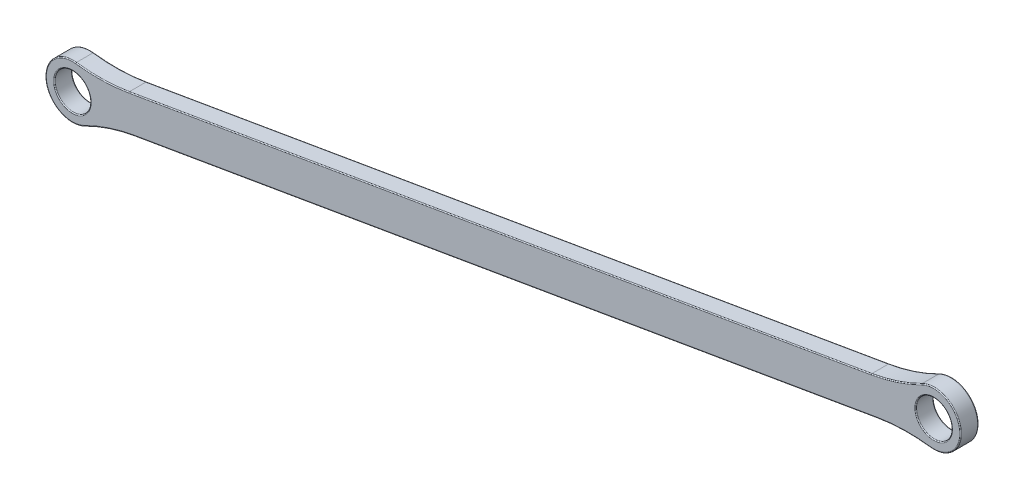
ISO-10303-21;
HEADER;
FILE_DESCRIPTION(('STEP AP214'),'2;1');
FILE_NAME('part.step','',(''),(''),'','','');
FILE_SCHEMA(('AUTOMOTIVE_DESIGN { 1 0 10303 214 1 1 1 1 }'));
ENDSEC;
DATA;
#1=APPLICATION_CONTEXT('core data for automotive mechanical design processes');
#2=APPLICATION_PROTOCOL_DEFINITION('international standard','automotive_design',2000,#1);
#3=PRODUCT_CONTEXT('',#1,'mechanical');
#4=PRODUCT('Part','Part','',(#3));
#5=PRODUCT_RELATED_PRODUCT_CATEGORY('part','',(#4));
#6=PRODUCT_DEFINITION_FORMATION('','',#4);
#7=PRODUCT_DEFINITION_CONTEXT('part definition',#1,'design');
#8=PRODUCT_DEFINITION('design','',#6,#7);
#9=PRODUCT_DEFINITION_SHAPE('','',#8);
#10=(LENGTH_UNIT() NAMED_UNIT(*) SI_UNIT(.MILLI.,.METRE.));
#11=(NAMED_UNIT(*) PLANE_ANGLE_UNIT() SI_UNIT($,.RADIAN.));
#12=(NAMED_UNIT(*) SI_UNIT($,.STERADIAN.) SOLID_ANGLE_UNIT());
#13=UNCERTAINTY_MEASURE_WITH_UNIT(LENGTH_MEASURE(1.E-05),#10,'distance_accuracy_value','');
#14=(GEOMETRIC_REPRESENTATION_CONTEXT(3) GLOBAL_UNCERTAINTY_ASSIGNED_CONTEXT((#13)) GLOBAL_UNIT_ASSIGNED_CONTEXT((#10,
#11,#12)) REPRESENTATION_CONTEXT('',''));
#15=CARTESIAN_POINT('',(0.,0.,0.));
#16=DIRECTION('',(0.,0.,1.));
#17=DIRECTION('',(1.,0.,0.));
#18=AXIS2_PLACEMENT_3D('',#15,#16,#17);
#19=CARTESIAN_POINT('',(-244.299808513797,197.944507587272,-3.));
#20=DIRECTION('',(0.,0.,1.));
#21=DIRECTION('',(1.,0.,0.));
#22=AXIS2_PLACEMENT_3D('',#19,#20,#21);
#23=CYLINDRICAL_SURFACE('',#22,4.50000000000002);
#24=DIRECTION('',(0.,0.,1.));
#25=VECTOR('',#24,1.);
#26=CARTESIAN_POINT('',(-243.732635553962,202.408621702483,-3.));
#27=LINE('',#26,#25);
#28=CARTESIAN_POINT('',(-243.732635553962,202.408621702483,-0.15));
#29=VERTEX_POINT('',#28);
#30=CARTESIAN_POINT('',(-243.732635553962,202.408621702483,-2.85));
#31=VERTEX_POINT('',#30);
#32=EDGE_CURVE('E268',#29,#31,#27,.F.);
#33=ORIENTED_EDGE('',*,*,#32,.T.);
#34=CARTESIAN_POINT('',(-244.299808513797,197.944507587272,-2.85));
#35=DIRECTION('',(0.,0.,1.));
#36=DIRECTION('',(1.,0.,0.));
#37=AXIS2_PLACEMENT_3D('',#34,#35,#36);
#38=CIRCLE('',#37,4.50000000000002);
#39=CARTESIAN_POINT('',(-242.279688784884,193.92342361888,-2.85));
#40=VERTEX_POINT('',#39);
#41=EDGE_CURVE('E227',#31,#40,#38,.T.);
#42=ORIENTED_EDGE('',*,*,#41,.T.);
#43=DIRECTION('',(0.,0.,1.));
#44=VECTOR('',#43,1.);
#45=CARTESIAN_POINT('',(-242.279688784884,193.92342361888,-3.));
#46=LINE('',#45,#44);
#47=CARTESIAN_POINT('',(-242.279688784884,193.92342361888,-0.15));
#48=VERTEX_POINT('',#47);
#49=EDGE_CURVE('E306',#40,#48,#46,.T.);
#50=ORIENTED_EDGE('',*,*,#49,.T.);
#51=CARTESIAN_POINT('',(-244.299808513797,197.944507587272,-0.15));
#52=DIRECTION('',(0.,0.,1.));
#53=DIRECTION('',(1.,0.,0.));
#54=AXIS2_PLACEMENT_3D('',#51,#52,#53);
#55=CIRCLE('',#54,4.50000000000002);
#56=EDGE_CURVE('E225',#48,#29,#55,.F.);
#57=ORIENTED_EDGE('',*,*,#56,.T.);
#58=EDGE_LOOP('',(#33,#42,#50,#57));
#59=FACE_BOUND('',#58,.T.);
#60=ADVANCED_FACE('F41',(#59),#23,.T.);
#61=CARTESIAN_POINT('',(-40.3944893803086,235.90351083221,-3.));
#62=DIRECTION('',(0.168776644892951,-0.98565432284279,0.));
#63=DIRECTION('',(0.98565432284279,0.168776644892951,0.));
#64=AXIS2_PLACEMENT_3D('',#61,#62,#63);
#65=PLANE('',#64);
#66=DIRECTION('',(0.,0.,1.));
#67=VECTOR('',#66,1.);
#68=CARTESIAN_POINT('',(-110.818562620297,223.844578480694,-3.));
#69=LINE('',#68,#67);
#70=CARTESIAN_POINT('',(-110.818562620297,223.844578480694,-0.15));
#71=VERTEX_POINT('',#70);
#72=CARTESIAN_POINT('',(-110.818562620297,223.844578480694,-2.85));
#73=VERTEX_POINT('',#72);
#74=EDGE_CURVE('E328',#71,#73,#69,.F.);
#75=ORIENTED_EDGE('',*,*,#74,.T.);
#76=DIRECTION('',(0.98565432284279,0.168776644892951,0.));
#77=VECTOR('',#76,1.);
#78=CARTESIAN_POINT('',(-40.3944893803086,235.90351083221,-2.85));
#79=LINE('',#78,#77);
#80=CARTESIAN_POINT('',(-234.888183141608,202.599752785278,-2.85));
#81=VERTEX_POINT('',#80);
#82=EDGE_CURVE('E219',#73,#81,#79,.F.);
#83=ORIENTED_EDGE('',*,*,#82,.T.);
#84=DIRECTION('',(0.,0.,1.));
#85=VECTOR('',#84,1.);
#86=CARTESIAN_POINT('',(-234.888183141608,202.599752785278,-3.));
#87=LINE('',#86,#85);
#88=CARTESIAN_POINT('',(-234.888183141608,202.599752785278,-0.15));
#89=VERTEX_POINT('',#88);
#90=EDGE_CURVE('E325',#81,#89,#87,.T.);
#91=ORIENTED_EDGE('',*,*,#90,.T.);
#92=DIRECTION('',(0.98565432284279,0.168776644892951,0.));
#93=VECTOR('',#92,1.);
#94=CARTESIAN_POINT('',(-110.818562620297,223.844578480694,-0.15));
#95=LINE('',#94,#93);
#96=EDGE_CURVE('E217',#89,#71,#95,.T.);
#97=ORIENTED_EDGE('',*,*,#96,.T.);
#98=EDGE_LOOP('',(#75,#83,#91,#97));
#99=FACE_BOUND('',#98,.T.);
#100=ADVANCED_FACE('F380',(#99),#65,.F.);
#101=CARTESIAN_POINT('',(-100.39427737875,222.585897741643,-3.));
#102=DIRECTION('',(0.,0.,1.));
#103=DIRECTION('',(1.,0.,0.));
#104=AXIS2_PLACEMENT_3D('',#101,#102,#103);
#105=CYLINDRICAL_SURFACE('',#104,4.50000000000001);
#106=DIRECTION('',(0.,0.,1.));
#107=VECTOR('',#106,1.);
#108=CARTESIAN_POINT('',(-100.961450338585,218.121783626431,-3.));
#109=LINE('',#108,#107);
#110=CARTESIAN_POINT('',(-100.961450338585,218.121783626431,-0.15));
#111=VERTEX_POINT('',#110);
#112=CARTESIAN_POINT('',(-100.961450338585,218.121783626431,-2.85));
#113=VERTEX_POINT('',#112);
#114=EDGE_CURVE('E322',#111,#113,#109,.F.);
#115=ORIENTED_EDGE('',*,*,#114,.T.);
#116=CARTESIAN_POINT('',(-100.39427737875,222.585897741643,-2.85));
#117=DIRECTION('',(0.,0.,1.));
#118=DIRECTION('',(1.,0.,0.));
#119=AXIS2_PLACEMENT_3D('',#116,#117,#118);
#120=CIRCLE('',#119,4.50000000000001);
#121=CARTESIAN_POINT('',(-102.414397107663,226.606981710034,-2.85));
#122=VERTEX_POINT('',#121);
#123=EDGE_CURVE('E210',#113,#122,#120,.T.);
#124=ORIENTED_EDGE('',*,*,#123,.T.);
#125=DIRECTION('',(0.,0.,1.));
#126=VECTOR('',#125,1.);
#127=CARTESIAN_POINT('',(-102.414397107663,226.606981710034,-3.));
#128=LINE('',#127,#126);
#129=CARTESIAN_POINT('',(-102.414397107663,226.606981710034,-0.15));
#130=VERTEX_POINT('',#129);
#131=EDGE_CURVE('E319',#122,#130,#128,.T.);
#132=ORIENTED_EDGE('',*,*,#131,.T.);
#133=CARTESIAN_POINT('',(-100.39427737875,222.585897741643,-0.15));
#134=DIRECTION('',(0.,0.,1.));
#135=DIRECTION('',(1.,0.,0.));
#136=AXIS2_PLACEMENT_3D('',#133,#134,#135);
#137=CIRCLE('',#136,4.50000000000001);
#138=EDGE_CURVE('E208',#130,#111,#137,.F.);
#139=ORIENTED_EDGE('',*,*,#138,.T.);
#140=EDGE_LOOP('',(#115,#124,#132,#139));
#141=FACE_BOUND('',#140,.T.);
#142=ADVANCED_FACE('F396',(#141),#105,.T.);
#143=CARTESIAN_POINT('',(-39.3818295109509,229.989584895153,-3.));
#144=DIRECTION('',(0.168776644892951,-0.98565432284279,0.));
#145=DIRECTION('',(0.98565432284279,0.168776644892951,0.));
#146=AXIS2_PLACEMENT_3D('',#143,#144,#145);
#147=PLANE('',#146);
#148=DIRECTION('',(0.,0.,-1.));
#149=VECTOR('',#148,1.);
#150=CARTESIAN_POINT('',(-233.87552327225,196.685826848221,-3.));
#151=LINE('',#150,#149);
#152=CARTESIAN_POINT('',(-233.87552327225,196.685826848221,-0.15));
#153=VERTEX_POINT('',#152);
#154=CARTESIAN_POINT('',(-233.87552327225,196.685826848221,-2.85));
#155=VERTEX_POINT('',#154);
#156=EDGE_CURVE('E308',#153,#155,#151,.T.);
#157=ORIENTED_EDGE('',*,*,#156,.T.);
#158=DIRECTION('',(0.98565432284279,0.168776644892951,0.));
#159=VECTOR('',#158,1.);
#160=CARTESIAN_POINT('',(-109.805902750939,217.930652543637,-2.85));
#161=LINE('',#160,#159);
#162=CARTESIAN_POINT('',(-109.805902750939,217.930652543637,-2.85));
#163=VERTEX_POINT('',#162);
#164=EDGE_CURVE('E202',#155,#163,#161,.T.);
#165=ORIENTED_EDGE('',*,*,#164,.T.);
#166=DIRECTION('',(0.,0.,-1.));
#167=VECTOR('',#166,1.);
#168=CARTESIAN_POINT('',(-109.805902750939,217.930652543637,0.));
#169=LINE('',#168,#167);
#170=CARTESIAN_POINT('',(-109.805902750939,217.930652543637,-0.15));
#171=VERTEX_POINT('',#170);
#172=EDGE_CURVE('E312',#163,#171,#169,.F.);
#173=ORIENTED_EDGE('',*,*,#172,.T.);
#174=DIRECTION('',(0.98565432284279,0.168776644892951,0.));
#175=VECTOR('',#174,1.);
#176=CARTESIAN_POINT('',(-39.3818295109509,229.989584895153,-0.15));
#177=LINE('',#176,#175);
#178=EDGE_CURVE('E200',#171,#153,#177,.F.);
#179=ORIENTED_EDGE('',*,*,#178,.T.);
#180=EDGE_LOOP('',(#157,#165,#173,#179));
#181=FACE_BOUND('',#180,.T.);
#182=ADVANCED_FACE('F351',(#181),#147,.T.);
#183=CARTESIAN_POINT('',(-100.39427737875,222.585897741643,-3.));
#184=DIRECTION('',(0.,0.,1.));
#185=DIRECTION('',(1.,0.,0.));
#186=AXIS2_PLACEMENT_3D('',#183,#184,#185);
#187=CYLINDRICAL_SURFACE('',#186,3.00000000000002);
#188=CARTESIAN_POINT('',(-100.39427737875,222.585897741643,-2.85));
#189=DIRECTION('',(0.,0.,1.));
#190=DIRECTION('',(1.,0.,0.));
#191=AXIS2_PLACEMENT_3D('',#188,#189,#190);
#192=CIRCLE('',#191,3.00000000000002);
#193=CARTESIAN_POINT('',(-97.3942773787499,222.585897741643,-2.85));
#194=VERTEX_POINT('',#193);
#195=EDGE_CURVE('E232',#194,#194,#192,.F.);
#196=ORIENTED_EDGE('',*,*,#195,.T.);
#197=EDGE_LOOP('',(#196));
#198=FACE_BOUND('',#197,.T.);
#199=CARTESIAN_POINT('',(-100.39427737875,222.585897741643,-0.15));
#200=DIRECTION('',(0.,0.,1.));
#201=DIRECTION('',(1.,0.,0.));
#202=AXIS2_PLACEMENT_3D('',#199,#200,#201);
#203=CIRCLE('',#202,3.00000000000002);
#204=CARTESIAN_POINT('',(-97.3942773787499,222.585897741643,-0.15));
#205=VERTEX_POINT('',#204);
#206=EDGE_CURVE('E229',#205,#205,#203,.T.);
#207=ORIENTED_EDGE('',*,*,#206,.T.);
#208=EDGE_LOOP('',(#207));
#209=FACE_BOUND('',#208,.T.);
#210=ADVANCED_FACE('F403',(#198,#209),#187,.F.);
#211=CARTESIAN_POINT('',(-244.299808513797,197.944507587272,-3.));
#212=DIRECTION('',(0.,0.,1.));
#213=DIRECTION('',(1.,0.,0.));
#214=AXIS2_PLACEMENT_3D('',#211,#212,#213);
#215=CYLINDRICAL_SURFACE('',#214,3.00000000000004);
#216=CARTESIAN_POINT('',(-244.299808513797,197.944507587272,-2.85));
#217=DIRECTION('',(0.,0.,1.));
#218=DIRECTION('',(1.,0.,0.));
#219=AXIS2_PLACEMENT_3D('',#216,#217,#218);
#220=CIRCLE('',#219,3.00000000000004);
#221=CARTESIAN_POINT('',(-241.299808513797,197.944507587272,-2.85));
#222=VERTEX_POINT('',#221);
#223=EDGE_CURVE('E194',#222,#222,#220,.F.);
#224=ORIENTED_EDGE('',*,*,#223,.T.);
#225=EDGE_LOOP('',(#224));
#226=FACE_BOUND('',#225,.T.);
#227=CARTESIAN_POINT('',(-244.299808513797,197.944507587272,-0.15));
#228=DIRECTION('',(0.,0.,1.));
#229=DIRECTION('',(1.,0.,0.));
#230=AXIS2_PLACEMENT_3D('',#227,#228,#229);
#231=CIRCLE('',#230,3.00000000000004);
#232=CARTESIAN_POINT('',(-241.299808513797,197.944507587272,-0.15));
#233=VERTEX_POINT('',#232);
#234=EDGE_CURVE('E186',#233,#233,#231,.T.);
#235=ORIENTED_EDGE('',*,*,#234,.T.);
#236=EDGE_LOOP('',(#235));
#237=FACE_BOUND('',#236,.T.);
#238=ADVANCED_FACE('F413',(#226,#237),#215,.F.);
#239=CARTESIAN_POINT('',(0.,0.,-3.));
#240=DIRECTION('',(0.,0.,1.));
#241=DIRECTION('',(1.,0.,0.));
#242=AXIS2_PLACEMENT_3D('',#239,#240,#241);
#243=PLANE('',#242);
#244=CARTESIAN_POINT('',(-244.299808513797,197.944507587272,-3.));
#245=DIRECTION('',(0.,0.,1.));
#246=DIRECTION('',(1.,0.,0.));
#247=AXIS2_PLACEMENT_3D('',#244,#245,#246);
#248=CIRCLE('',#247,3.15000000000003);
#249=CARTESIAN_POINT('',(-241.149808513797,197.944507587272,-3.));
#250=VERTEX_POINT('',#249);
#251=EDGE_CURVE('E183',#250,#250,#248,.T.);
#252=ORIENTED_EDGE('',*,*,#251,.T.);
#253=EDGE_LOOP('',(#252));
#254=FACE_BOUND('',#253,.T.);
#255=DIRECTION('',(0.98565432284279,0.168776644892951,0.));
#256=VECTOR('',#255,1.);
#257=CARTESIAN_POINT('',(-233.900839768984,196.833674996647,-3.));
#258=LINE('',#257,#256);
#259=CARTESIAN_POINT('',(-109.831219247673,218.078500692063,-3.));
#260=VERTEX_POINT('',#259);
#261=CARTESIAN_POINT('',(-233.900839768984,196.833674996647,-3.));
#262=VERTEX_POINT('',#261);
#263=EDGE_CURVE('E181',#260,#262,#258,.F.);
#264=ORIENTED_EDGE('',*,*,#263,.T.);
#265=CARTESIAN_POINT('',(-228.812223925461,167.116197162937,-3.));
#266=DIRECTION('',(0.,0.,1.));
#267=DIRECTION('',(1.,0.,0.));
#268=AXIS2_PLACEMENT_3D('',#265,#266,#267);
#269=CIRCLE('',#268,30.15);
#270=CARTESIAN_POINT('',(-242.347026109181,194.05745975116,-3.));
#271=VERTEX_POINT('',#270);
#272=EDGE_CURVE('E161',#262,#271,#269,.T.);
#273=ORIENTED_EDGE('',*,*,#272,.T.);
#274=CARTESIAN_POINT('',(-244.299808513797,197.944507587272,-3.));
#275=DIRECTION('',(0.,0.,1.));
#276=DIRECTION('',(1.,0.,0.));
#277=AXIS2_PLACEMENT_3D('',#274,#275,#276);
#278=CIRCLE('',#277,4.35000000000002);
#279=CARTESIAN_POINT('',(-243.75154131929,202.259817898643,-3.));
#280=VERTEX_POINT('',#279);
#281=EDGE_CURVE('E169',#271,#280,#278,.F.);
#282=ORIENTED_EDGE('',*,*,#281,.T.);
#283=CARTESIAN_POINT('',(-239.951482488396,232.169382470561,-3.));
#284=DIRECTION('',(0.,0.,1.));
#285=DIRECTION('',(1.,0.,0.));
#286=AXIS2_PLACEMENT_3D('',#283,#284,#285);
#287=CIRCLE('',#286,30.15);
#288=CARTESIAN_POINT('',(-234.862866644874,202.451904636851,-3.));
#289=VERTEX_POINT('',#288);
#290=EDGE_CURVE('E175',#280,#289,#287,.T.);
#291=ORIENTED_EDGE('',*,*,#290,.T.);
#292=DIRECTION('',(0.98565432284279,0.168776644892951,0.));
#293=VECTOR('',#292,1.);
#294=CARTESIAN_POINT('',(-40.3691728835746,235.755662683783,-3.));
#295=LINE('',#294,#293);
#296=CARTESIAN_POINT('',(-110.793246123563,223.696730332267,-3.));
#297=VERTEX_POINT('',#296);
#298=EDGE_CURVE('E334',#289,#297,#295,.T.);
#299=ORIENTED_EDGE('',*,*,#298,.T.);
#300=CARTESIAN_POINT('',(-115.881861967086,253.414208165977,-3.));
#301=DIRECTION('',(0.,0.,1.));
#302=DIRECTION('',(1.,0.,0.));
#303=AXIS2_PLACEMENT_3D('',#300,#301,#302);
#304=CIRCLE('',#303,30.15);
#305=CARTESIAN_POINT('',(-102.347059783366,226.472945577754,-3.));
#306=VERTEX_POINT('',#305);
#307=EDGE_CURVE('E336',#297,#306,#304,.T.);
#308=ORIENTED_EDGE('',*,*,#307,.T.);
#309=CARTESIAN_POINT('',(-100.39427737875,222.585897741643,-3.));
#310=DIRECTION('',(0.,0.,1.));
#311=DIRECTION('',(1.,0.,0.));
#312=AXIS2_PLACEMENT_3D('',#309,#310,#311);
#313=CIRCLE('',#312,4.35000000000001);
#314=CARTESIAN_POINT('',(-100.942544573257,218.270587430271,-3.));
#315=VERTEX_POINT('',#314);
#316=EDGE_CURVE('E338',#306,#315,#313,.F.);
#317=ORIENTED_EDGE('',*,*,#316,.T.);
#318=CARTESIAN_POINT('',(-104.742603404151,188.361022858353,-3.));
#319=DIRECTION('',(0.,0.,1.));
#320=DIRECTION('',(1.,0.,0.));
#321=AXIS2_PLACEMENT_3D('',#318,#319,#320);
#322=CIRCLE('',#321,30.15);
#323=EDGE_CURVE('E188',#315,#260,#322,.T.);
#324=ORIENTED_EDGE('',*,*,#323,.T.);
#325=EDGE_LOOP('',(#264,#273,#282,#291,#299,#308,#317,#324));
#326=FACE_BOUND('',#325,.T.);
#327=CARTESIAN_POINT('',(-100.39427737875,222.585897741643,-3.));
#328=DIRECTION('',(0.,0.,1.));
#329=DIRECTION('',(1.,0.,0.));
#330=AXIS2_PLACEMENT_3D('',#327,#328,#329);
#331=CIRCLE('',#330,3.15000000000002);
#332=CARTESIAN_POINT('',(-97.24427737875,222.585897741643,-3.));
#333=VERTEX_POINT('',#332);
#334=EDGE_CURVE('E176',#333,#333,#331,.T.);
#335=ORIENTED_EDGE('',*,*,#334,.T.);
#336=EDGE_LOOP('',(#335));
#337=FACE_BOUND('',#336,.T.);
#338=ADVANCED_FACE('F178',(#254,#326,#337),#243,.F.);
#339=CARTESIAN_POINT('',(0.,0.,0.));
#340=DIRECTION('',(0.,0.,1.));
#341=DIRECTION('',(1.,0.,0.));
#342=AXIS2_PLACEMENT_3D('',#339,#340,#341);
#343=PLANE('',#342);
#344=CARTESIAN_POINT('',(-244.299808513797,197.944507587272,0.));
#345=DIRECTION('',(0.,0.,1.));
#346=DIRECTION('',(1.,0.,0.));
#347=AXIS2_PLACEMENT_3D('',#344,#345,#346);
#348=CIRCLE('',#347,3.15000000000003);
#349=CARTESIAN_POINT('',(-241.149808513797,197.944507587272,0.));
#350=VERTEX_POINT('',#349);
#351=EDGE_CURVE('E11',#350,#350,#348,.F.);
#352=ORIENTED_EDGE('',*,*,#351,.T.);
#353=EDGE_LOOP('',(#352));
#354=FACE_BOUND('',#353,.T.);
#355=CARTESIAN_POINT('',(-100.39427737875,222.585897741643,0.));
#356=DIRECTION('',(0.,0.,1.));
#357=DIRECTION('',(1.,0.,0.));
#358=AXIS2_PLACEMENT_3D('',#355,#356,#357);
#359=CIRCLE('',#358,4.35000000000001);
#360=CARTESIAN_POINT('',(-100.942544573257,218.270587430271,0.));
#361=VERTEX_POINT('',#360);
#362=CARTESIAN_POINT('',(-102.347059783366,226.472945577754,0.));
#363=VERTEX_POINT('',#362);
#364=EDGE_CURVE('E58',#361,#363,#359,.T.);
#365=ORIENTED_EDGE('',*,*,#364,.T.);
#366=CARTESIAN_POINT('',(-115.881861967086,253.414208165977,0.));
#367=DIRECTION('',(0.,0.,1.));
#368=DIRECTION('',(1.,0.,0.));
#369=AXIS2_PLACEMENT_3D('',#366,#367,#368);
#370=CIRCLE('',#369,30.15);
#371=CARTESIAN_POINT('',(-110.793246123563,223.696730332267,0.));
#372=VERTEX_POINT('',#371);
#373=EDGE_CURVE('E50',#363,#372,#370,.F.);
#374=ORIENTED_EDGE('',*,*,#373,.T.);
#375=DIRECTION('',(0.98565432284279,0.168776644892951,0.));
#376=VECTOR('',#375,1.);
#377=CARTESIAN_POINT('',(-234.862866644874,202.451904636851,0.));
#378=LINE('',#377,#376);
#379=CARTESIAN_POINT('',(-234.862866644874,202.451904636851,0.));
#380=VERTEX_POINT('',#379);
#381=EDGE_CURVE('E238',#372,#380,#378,.F.);
#382=ORIENTED_EDGE('',*,*,#381,.T.);
#383=CARTESIAN_POINT('',(-239.951482488396,232.169382470561,0.));
#384=DIRECTION('',(0.,0.,1.));
#385=DIRECTION('',(1.,0.,0.));
#386=AXIS2_PLACEMENT_3D('',#383,#384,#385);
#387=CIRCLE('',#386,30.15);
#388=CARTESIAN_POINT('',(-243.75154131929,202.259817898643,0.));
#389=VERTEX_POINT('',#388);
#390=EDGE_CURVE('E240',#380,#389,#387,.F.);
#391=ORIENTED_EDGE('',*,*,#390,.T.);
#392=CARTESIAN_POINT('',(-244.299808513797,197.944507587272,0.));
#393=DIRECTION('',(0.,0.,1.));
#394=DIRECTION('',(1.,0.,0.));
#395=AXIS2_PLACEMENT_3D('',#392,#393,#394);
#396=CIRCLE('',#395,4.35000000000002);
#397=CARTESIAN_POINT('',(-242.347026109181,194.05745975116,0.));
#398=VERTEX_POINT('',#397);
#399=EDGE_CURVE('E242',#389,#398,#396,.T.);
#400=ORIENTED_EDGE('',*,*,#399,.T.);
#401=CARTESIAN_POINT('',(-228.812223925461,167.116197162937,0.));
#402=DIRECTION('',(0.,0.,1.));
#403=DIRECTION('',(1.,0.,0.));
#404=AXIS2_PLACEMENT_3D('',#401,#402,#403);
#405=CIRCLE('',#404,30.15);
#406=CARTESIAN_POINT('',(-233.900839768984,196.833674996647,0.));
#407=VERTEX_POINT('',#406);
#408=EDGE_CURVE('E244',#398,#407,#405,.F.);
#409=ORIENTED_EDGE('',*,*,#408,.T.);
#410=DIRECTION('',(0.98565432284279,0.168776644892951,0.));
#411=VECTOR('',#410,1.);
#412=CARTESIAN_POINT('',(-39.4071460076849,230.137433043579,0.));
#413=LINE('',#412,#411);
#414=CARTESIAN_POINT('',(-109.831219247673,218.078500692063,0.));
#415=VERTEX_POINT('',#414);
#416=EDGE_CURVE('E246',#407,#415,#413,.T.);
#417=ORIENTED_EDGE('',*,*,#416,.T.);
#418=CARTESIAN_POINT('',(-104.742603404151,188.361022858353,0.));
#419=DIRECTION('',(0.,0.,1.));
#420=DIRECTION('',(1.,0.,0.));
#421=AXIS2_PLACEMENT_3D('',#418,#419,#420);
#422=CIRCLE('',#421,30.15);
#423=EDGE_CURVE('E63',#415,#361,#422,.F.);
#424=ORIENTED_EDGE('',*,*,#423,.T.);
#425=EDGE_LOOP('',(#365,#374,#382,#391,#400,#409,#417,#424));
#426=FACE_BOUND('',#425,.T.);
#427=CARTESIAN_POINT('',(-100.39427737875,222.585897741643,0.));
#428=DIRECTION('',(0.,0.,1.));
#429=DIRECTION('',(1.,0.,0.));
#430=AXIS2_PLACEMENT_3D('',#427,#428,#429);
#431=CIRCLE('',#430,3.15000000000002);
#432=CARTESIAN_POINT('',(-97.24427737875,222.585897741643,0.));
#433=VERTEX_POINT('',#432);
#434=EDGE_CURVE('E235',#433,#433,#431,.F.);
#435=ORIENTED_EDGE('',*,*,#434,.T.);
#436=EDGE_LOOP('',(#435));
#437=FACE_BOUND('',#436,.T.);
#438=ADVANCED_FACE('F367',(#354,#426,#437),#343,.T.);
#439=CARTESIAN_POINT('',(-228.812223925461,167.116197162937,-3.));
#440=DIRECTION('',(0.,0.,1.));
#441=DIRECTION('',(1.,0.,0.));
#442=AXIS2_PLACEMENT_3D('',#439,#440,#441);
#443=CYLINDRICAL_SURFACE('',#442,30.);
#444=ORIENTED_EDGE('',*,*,#49,.F.);
#445=CARTESIAN_POINT('',(-228.812223925461,167.116197162937,-2.85));
#446=DIRECTION('',(0.,0.,1.));
#447=DIRECTION('',(1.,0.,0.));
#448=AXIS2_PLACEMENT_3D('',#445,#446,#447);
#449=CIRCLE('',#448,30.);
#450=EDGE_CURVE('E163',#40,#155,#449,.F.);
#451=ORIENTED_EDGE('',*,*,#450,.T.);
#452=ORIENTED_EDGE('',*,*,#156,.F.);
#453=CARTESIAN_POINT('',(-228.812223925461,167.116197162937,-0.15));
#454=DIRECTION('',(0.,0.,1.));
#455=DIRECTION('',(1.,0.,0.));
#456=AXIS2_PLACEMENT_3D('',#453,#454,#455);
#457=CIRCLE('',#456,30.);
#458=EDGE_CURVE('E197',#153,#48,#457,.T.);
#459=ORIENTED_EDGE('',*,*,#458,.T.);
#460=EDGE_LOOP('',(#444,#451,#452,#459));
#461=FACE_BOUND('',#460,.T.);
#462=ADVANCED_FACE('F305',(#461),#443,.F.);
#463=CARTESIAN_POINT('',(-104.742603404151,188.361022858353,-3.));
#464=DIRECTION('',(0.,0.,1.));
#465=DIRECTION('',(1.,0.,0.));
#466=AXIS2_PLACEMENT_3D('',#463,#464,#465);
#467=CYLINDRICAL_SURFACE('',#466,30.);
#468=ORIENTED_EDGE('',*,*,#172,.F.);
#469=CARTESIAN_POINT('',(-104.742603404151,188.361022858353,-2.85));
#470=DIRECTION('',(0.,0.,1.));
#471=DIRECTION('',(1.,0.,0.));
#472=AXIS2_PLACEMENT_3D('',#469,#470,#471);
#473=CIRCLE('',#472,30.);
#474=EDGE_CURVE('E206',#163,#113,#473,.F.);
#475=ORIENTED_EDGE('',*,*,#474,.T.);
#476=ORIENTED_EDGE('',*,*,#114,.F.);
#477=CARTESIAN_POINT('',(-104.742603404151,188.361022858353,-0.15));
#478=DIRECTION('',(0.,0.,1.));
#479=DIRECTION('',(1.,0.,0.));
#480=AXIS2_PLACEMENT_3D('',#477,#478,#479);
#481=CIRCLE('',#480,30.);
#482=EDGE_CURVE('E204',#111,#171,#481,.T.);
#483=ORIENTED_EDGE('',*,*,#482,.T.);
#484=EDGE_LOOP('',(#468,#475,#476,#483));
#485=FACE_BOUND('',#484,.T.);
#486=ADVANCED_FACE('F353',(#485),#467,.F.);
#487=CARTESIAN_POINT('',(-115.881861967086,253.414208165977,-3.));
#488=DIRECTION('',(0.,0.,1.));
#489=DIRECTION('',(1.,0.,0.));
#490=AXIS2_PLACEMENT_3D('',#487,#488,#489);
#491=CYLINDRICAL_SURFACE('',#490,30.);
#492=ORIENTED_EDGE('',*,*,#131,.F.);
#493=CARTESIAN_POINT('',(-115.881861967086,253.414208165977,-2.85));
#494=DIRECTION('',(0.,0.,1.));
#495=DIRECTION('',(1.,0.,0.));
#496=AXIS2_PLACEMENT_3D('',#493,#494,#495);
#497=CIRCLE('',#496,30.);
#498=EDGE_CURVE('E215',#122,#73,#497,.F.);
#499=ORIENTED_EDGE('',*,*,#498,.T.);
#500=ORIENTED_EDGE('',*,*,#74,.F.);
#501=CARTESIAN_POINT('',(-115.881861967086,253.414208165977,-0.15));
#502=DIRECTION('',(0.,0.,1.));
#503=DIRECTION('',(1.,0.,0.));
#504=AXIS2_PLACEMENT_3D('',#501,#502,#503);
#505=CIRCLE('',#504,30.);
#506=EDGE_CURVE('E212',#71,#130,#505,.T.);
#507=ORIENTED_EDGE('',*,*,#506,.T.);
#508=EDGE_LOOP('',(#492,#499,#500,#507));
#509=FACE_BOUND('',#508,.T.);
#510=ADVANCED_FACE('F385',(#509),#491,.F.);
#511=CARTESIAN_POINT('',(-239.951482488396,232.169382470561,-3.));
#512=DIRECTION('',(0.,0.,1.));
#513=DIRECTION('',(1.,0.,0.));
#514=AXIS2_PLACEMENT_3D('',#511,#512,#513);
#515=CYLINDRICAL_SURFACE('',#514,30.);
#516=ORIENTED_EDGE('',*,*,#90,.F.);
#517=CARTESIAN_POINT('',(-239.951482488396,232.169382470561,-2.85));
#518=DIRECTION('',(0.,0.,1.));
#519=DIRECTION('',(1.,0.,0.));
#520=AXIS2_PLACEMENT_3D('',#517,#518,#519);
#521=CIRCLE('',#520,30.);
#522=EDGE_CURVE('E223',#81,#31,#521,.F.);
#523=ORIENTED_EDGE('',*,*,#522,.T.);
#524=ORIENTED_EDGE('',*,*,#32,.F.);
#525=CARTESIAN_POINT('',(-239.951482488396,232.169382470561,-0.15));
#526=DIRECTION('',(0.,0.,1.));
#527=DIRECTION('',(1.,0.,0.));
#528=AXIS2_PLACEMENT_3D('',#525,#526,#527);
#529=CIRCLE('',#528,30.);
#530=EDGE_CURVE('E221',#29,#89,#529,.T.);
#531=ORIENTED_EDGE('',*,*,#530,.T.);
#532=EDGE_LOOP('',(#516,#523,#524,#531));
#533=FACE_BOUND('',#532,.T.);
#534=ADVANCED_FACE('F421',(#533),#515,.F.);
#535=CARTESIAN_POINT('',(-244.299808513797,197.944507587272,-2.85));
#536=DIRECTION('',(0.,0.,1.));
#537=DIRECTION('',(1.,0.,0.));
#538=AXIS2_PLACEMENT_3D('',#535,#536,#537);
#539=TOROIDAL_SURFACE('',#538,3.15000000000003,0.15);
#540=ORIENTED_EDGE('',*,*,#223,.F.);
#541=EDGE_LOOP('',(#540));
#542=FACE_BOUND('',#541,.T.);
#543=ORIENTED_EDGE('',*,*,#251,.F.);
#544=EDGE_LOOP('',(#543));
#545=FACE_BOUND('',#544,.T.);
#546=ADVANCED_FACE('F424',(#542,#545),#539,.T.);
#547=CARTESIAN_POINT('',(-115.881861967086,253.414208165977,-2.85));
#548=DIRECTION('',(0.,0.,1.));
#549=DIRECTION('',(1.,0.,0.));
#550=AXIS2_PLACEMENT_3D('',#547,#548,#549);
#551=TOROIDAL_SURFACE('',#550,30.15,0.15);
#552=CARTESIAN_POINT('',(-110.793246123563,223.696730332267,-2.85));
#553=DIRECTION('',(-0.985654322842789,-0.168776644892957,0.));
#554=DIRECTION('',(0.168776644892957,-0.985654322842789,0.));
#555=AXIS2_PLACEMENT_3D('',#552,#553,#554);
#556=CIRCLE('',#555,0.15);
#557=EDGE_CURVE('E262',#73,#297,#556,.T.);
#558=ORIENTED_EDGE('',*,*,#557,.F.);
#559=ORIENTED_EDGE('',*,*,#498,.F.);
#560=CARTESIAN_POINT('',(-102.347059783366,226.472945577754,-2.85));
#561=DIRECTION('',(0.893574215198096,0.448915495314102,0.));
#562=DIRECTION('',(-0.448915495314102,0.893574215198096,0.));
#563=AXIS2_PLACEMENT_3D('',#560,#561,#562);
#564=CIRCLE('',#563,0.15);
#565=EDGE_CURVE('E265',#306,#122,#564,.T.);
#566=ORIENTED_EDGE('',*,*,#565,.F.);
#567=ORIENTED_EDGE('',*,*,#307,.F.);
#568=EDGE_LOOP('',(#558,#559,#566,#567));
#569=FACE_BOUND('',#568,.T.);
#570=ADVANCED_FACE('F389',(#569),#551,.T.);
#571=CARTESIAN_POINT('',(-100.39427737875,222.585897741643,-2.85));
#572=DIRECTION('',(0.,0.,1.));
#573=DIRECTION('',(1.,0.,0.));
#574=AXIS2_PLACEMENT_3D('',#571,#572,#573);
#575=TOROIDAL_SURFACE('',#574,4.35000000000001,0.15);
#576=ORIENTED_EDGE('',*,*,#565,.T.);
#577=ORIENTED_EDGE('',*,*,#123,.F.);
#578=CARTESIAN_POINT('',(-100.942544573257,218.270587430271,-2.85));
#579=DIRECTION('',(-0.992025358935932,0.126038435518836,0.));
#580=DIRECTION('',(-0.126038435518836,-0.992025358935932,0.));
#581=AXIS2_PLACEMENT_3D('',#578,#579,#580);
#582=CIRCLE('',#581,0.15);
#583=EDGE_CURVE('E259',#315,#113,#582,.T.);
#584=ORIENTED_EDGE('',*,*,#583,.F.);
#585=ORIENTED_EDGE('',*,*,#316,.F.);
#586=EDGE_LOOP('',(#576,#577,#584,#585));
#587=FACE_BOUND('',#586,.T.);
#588=ADVANCED_FACE('F394',(#587),#575,.T.);
#589=CARTESIAN_POINT('',(-40.3691728835746,235.755662683783,-2.85));
#590=DIRECTION('',(0.98565432284279,0.168776644892951,0.));
#591=DIRECTION('',(-0.168776644892951,0.98565432284279,0.));
#592=AXIS2_PLACEMENT_3D('',#589,#590,#591);
#593=CYLINDRICAL_SURFACE('',#592,0.15);
#594=ORIENTED_EDGE('',*,*,#557,.T.);
#595=ORIENTED_EDGE('',*,*,#298,.F.);
#596=CARTESIAN_POINT('',(-234.862866644874,202.451904636851,-2.85));
#597=DIRECTION('',(-0.985654322842804,-0.168776644892867,0.));
#598=DIRECTION('',(0.168776644892867,-0.985654322842804,0.));
#599=AXIS2_PLACEMENT_3D('',#596,#597,#598);
#600=CIRCLE('',#599,0.15);
#601=EDGE_CURVE('E256',#81,#289,#600,.T.);
#602=ORIENTED_EDGE('',*,*,#601,.F.);
#603=ORIENTED_EDGE('',*,*,#82,.F.);
#604=EDGE_LOOP('',(#594,#595,#602,#603));
#605=FACE_BOUND('',#604,.T.);
#606=ADVANCED_FACE('F442',(#605),#593,.T.);
#607=CARTESIAN_POINT('',(-104.742603404151,188.361022858353,-2.85));
#608=DIRECTION('',(0.,0.,1.));
#609=DIRECTION('',(1.,0.,0.));
#610=AXIS2_PLACEMENT_3D('',#607,#608,#609);
#611=TOROIDAL_SURFACE('',#610,30.15,0.15);
#612=ORIENTED_EDGE('',*,*,#583,.T.);
#613=ORIENTED_EDGE('',*,*,#474,.F.);
#614=CARTESIAN_POINT('',(-109.831219247673,218.078500692063,-2.85));
#615=DIRECTION('',(-0.985654322842789,-0.168776644892957,0.));
#616=DIRECTION('',(0.168776644892957,-0.985654322842789,0.));
#617=AXIS2_PLACEMENT_3D('',#614,#615,#616);
#618=CIRCLE('',#617,0.15);
#619=EDGE_CURVE('E253',#260,#163,#618,.T.);
#620=ORIENTED_EDGE('',*,*,#619,.F.);
#621=ORIENTED_EDGE('',*,*,#323,.F.);
#622=EDGE_LOOP('',(#612,#613,#620,#621));
#623=FACE_BOUND('',#622,.T.);
#624=ADVANCED_FACE('F345',(#623),#611,.T.);
#625=CARTESIAN_POINT('',(-239.951482488396,232.169382470561,-2.85));
#626=DIRECTION('',(0.,0.,1.));
#627=DIRECTION('',(1.,0.,0.));
#628=AXIS2_PLACEMENT_3D('',#625,#626,#627);
#629=TOROIDAL_SURFACE('',#628,30.15,0.15);
#630=ORIENTED_EDGE('',*,*,#601,.T.);
#631=ORIENTED_EDGE('',*,*,#290,.F.);
#632=CARTESIAN_POINT('',(-243.75154131929,202.259817898643,-2.85));
#633=DIRECTION('',(-0.992025358935917,0.126038435518951,0.));
#634=DIRECTION('',(-0.126038435518951,-0.992025358935917,0.));
#635=AXIS2_PLACEMENT_3D('',#632,#633,#634);
#636=CIRCLE('',#635,0.15);
#637=EDGE_CURVE('E172',#31,#280,#636,.T.);
#638=ORIENTED_EDGE('',*,*,#637,.F.);
#639=ORIENTED_EDGE('',*,*,#522,.F.);
#640=EDGE_LOOP('',(#630,#631,#638,#639));
#641=FACE_BOUND('',#640,.T.);
#642=ADVANCED_FACE('F436',(#641),#629,.T.);
#643=CARTESIAN_POINT('',(-39.4071460076849,230.137433043579,-2.85));
#644=DIRECTION('',(-0.98565432284279,-0.168776644892951,0.));
#645=DIRECTION('',(0.168776644892951,-0.98565432284279,0.));
#646=AXIS2_PLACEMENT_3D('',#643,#644,#645);
#647=CYLINDRICAL_SURFACE('',#646,0.15);
#648=ORIENTED_EDGE('',*,*,#619,.T.);
#649=ORIENTED_EDGE('',*,*,#164,.F.);
#650=CARTESIAN_POINT('',(-233.900839768984,196.833674996647,-2.85));
#651=DIRECTION('',(-0.985654322842804,-0.168776644892867,0.));
#652=DIRECTION('',(0.168776644892867,-0.985654322842804,0.));
#653=AXIS2_PLACEMENT_3D('',#650,#651,#652);
#654=CIRCLE('',#653,0.15);
#655=EDGE_CURVE('E166',#262,#155,#654,.T.);
#656=ORIENTED_EDGE('',*,*,#655,.F.);
#657=ORIENTED_EDGE('',*,*,#263,.F.);
#658=EDGE_LOOP('',(#648,#649,#656,#657));
#659=FACE_BOUND('',#658,.T.);
#660=ADVANCED_FACE('F348',(#659),#647,.T.);
#661=CARTESIAN_POINT('',(-244.299808513797,197.944507587272,-2.85));
#662=DIRECTION('',(0.,0.,1.));
#663=DIRECTION('',(1.,0.,0.));
#664=AXIS2_PLACEMENT_3D('',#661,#662,#663);
#665=TOROIDAL_SURFACE('',#664,4.35000000000002,0.15);
#666=ORIENTED_EDGE('',*,*,#637,.T.);
#667=ORIENTED_EDGE('',*,*,#281,.F.);
#668=CARTESIAN_POINT('',(-242.347026109181,194.05745975116,-2.85));
#669=DIRECTION('',(0.893574215198097,0.448915495314102,0.));
#670=DIRECTION('',(-0.448915495314102,0.893574215198097,0.));
#671=AXIS2_PLACEMENT_3D('',#668,#669,#670);
#672=CIRCLE('',#671,0.15);
#673=EDGE_CURVE('E157',#40,#271,#672,.T.);
#674=ORIENTED_EDGE('',*,*,#673,.F.);
#675=ORIENTED_EDGE('',*,*,#41,.F.);
#676=EDGE_LOOP('',(#666,#667,#674,#675));
#677=FACE_BOUND('',#676,.T.);
#678=ADVANCED_FACE('F170',(#677),#665,.T.);
#679=CARTESIAN_POINT('',(-228.812223925461,167.116197162937,-2.85));
#680=DIRECTION('',(0.,0.,1.));
#681=DIRECTION('',(1.,0.,0.));
#682=AXIS2_PLACEMENT_3D('',#679,#680,#681);
#683=TOROIDAL_SURFACE('',#682,30.15,0.15);
#684=ORIENTED_EDGE('',*,*,#655,.T.);
#685=ORIENTED_EDGE('',*,*,#450,.F.);
#686=ORIENTED_EDGE('',*,*,#673,.T.);
#687=ORIENTED_EDGE('',*,*,#272,.F.);
#688=EDGE_LOOP('',(#684,#685,#686,#687));
#689=FACE_BOUND('',#688,.T.);
#690=ADVANCED_FACE('F159',(#689),#683,.T.);
#691=CARTESIAN_POINT('',(-100.39427737875,222.585897741643,-2.85));
#692=DIRECTION('',(0.,0.,1.));
#693=DIRECTION('',(1.,0.,0.));
#694=AXIS2_PLACEMENT_3D('',#691,#692,#693);
#695=TOROIDAL_SURFACE('',#694,3.15000000000002,0.15);
#696=ORIENTED_EDGE('',*,*,#195,.F.);
#697=EDGE_LOOP('',(#696));
#698=FACE_BOUND('',#697,.T.);
#699=ORIENTED_EDGE('',*,*,#334,.F.);
#700=EDGE_LOOP('',(#699));
#701=FACE_BOUND('',#700,.T.);
#702=ADVANCED_FACE('F431',(#698,#701),#695,.T.);
#703=CARTESIAN_POINT('',(-244.299808513797,197.944507587272,-0.15));
#704=DIRECTION('',(0.,0.,1.));
#705=DIRECTION('',(1.,0.,0.));
#706=AXIS2_PLACEMENT_3D('',#703,#704,#705);
#707=TOROIDAL_SURFACE('',#706,3.15000000000003,0.15);
#708=ORIENTED_EDGE('',*,*,#351,.F.);
#709=EDGE_LOOP('',(#708));
#710=FACE_BOUND('',#709,.T.);
#711=ORIENTED_EDGE('',*,*,#234,.F.);
#712=EDGE_LOOP('',(#711));
#713=FACE_BOUND('',#712,.T.);
#714=ADVANCED_FACE('F452',(#710,#713),#707,.T.);
#715=CARTESIAN_POINT('',(-228.812223925461,167.116197162937,-0.15));
#716=DIRECTION('',(0.,0.,1.));
#717=DIRECTION('',(1.,0.,0.));
#718=AXIS2_PLACEMENT_3D('',#715,#716,#717);
#719=TOROIDAL_SURFACE('',#718,30.15,0.15);
#720=CARTESIAN_POINT('',(-242.347026109181,194.05745975116,-0.15));
#721=DIRECTION('',(-0.893574215198097,-0.448915495314102,0.));
#722=DIRECTION('',(0.448915495314102,-0.893574215198097,0.));
#723=AXIS2_PLACEMENT_3D('',#720,#721,#722);
#724=CIRCLE('',#723,0.15);
#725=EDGE_CURVE('E284',#48,#398,#724,.T.);
#726=ORIENTED_EDGE('',*,*,#725,.F.);
#727=ORIENTED_EDGE('',*,*,#458,.F.);
#728=CARTESIAN_POINT('',(-233.900839768984,196.833674996647,-0.15));
#729=DIRECTION('',(0.985654322842804,0.168776644892867,0.));
#730=DIRECTION('',(-0.168776644892867,0.985654322842804,0.));
#731=AXIS2_PLACEMENT_3D('',#728,#729,#730);
#732=CIRCLE('',#731,0.15);
#733=EDGE_CURVE('E45',#407,#153,#732,.T.);
#734=ORIENTED_EDGE('',*,*,#733,.F.);
#735=ORIENTED_EDGE('',*,*,#408,.F.);
#736=EDGE_LOOP('',(#726,#727,#734,#735));
#737=FACE_BOUND('',#736,.T.);
#738=ADVANCED_FACE('F300',(#737),#719,.T.);
#739=CARTESIAN_POINT('',(-39.4071460076849,230.137433043579,-0.15));
#740=DIRECTION('',(0.98565432284279,0.168776644892951,0.));
#741=DIRECTION('',(-0.168776644892951,0.98565432284279,0.));
#742=AXIS2_PLACEMENT_3D('',#739,#740,#741);
#743=CYLINDRICAL_SURFACE('',#742,0.15);
#744=ORIENTED_EDGE('',*,*,#733,.T.);
#745=ORIENTED_EDGE('',*,*,#178,.F.);
#746=CARTESIAN_POINT('',(-109.831219247673,218.078500692063,-0.15));
#747=DIRECTION('',(0.985654322842789,0.168776644892957,0.));
#748=DIRECTION('',(-0.168776644892957,0.985654322842789,0.));
#749=AXIS2_PLACEMENT_3D('',#746,#747,#748);
#750=CIRCLE('',#749,0.15);
#751=EDGE_CURVE('E282',#415,#171,#750,.T.);
#752=ORIENTED_EDGE('',*,*,#751,.F.);
#753=ORIENTED_EDGE('',*,*,#416,.F.);
#754=EDGE_LOOP('',(#744,#745,#752,#753));
#755=FACE_BOUND('',#754,.T.);
#756=ADVANCED_FACE('F295',(#755),#743,.T.);
#757=CARTESIAN_POINT('',(-244.299808513797,197.944507587272,-0.15));
#758=DIRECTION('',(0.,0.,1.));
#759=DIRECTION('',(1.,0.,0.));
#760=AXIS2_PLACEMENT_3D('',#757,#758,#759);
#761=TOROIDAL_SURFACE('',#760,4.35000000000002,0.15);
#762=ORIENTED_EDGE('',*,*,#725,.T.);
#763=ORIENTED_EDGE('',*,*,#399,.F.);
#764=CARTESIAN_POINT('',(-243.75154131929,202.259817898643,-0.15));
#765=DIRECTION('',(0.992025358935917,-0.126038435518951,0.));
#766=DIRECTION('',(0.126038435518951,0.992025358935917,0.));
#767=AXIS2_PLACEMENT_3D('',#764,#765,#766);
#768=CIRCLE('',#767,0.15);
#769=EDGE_CURVE('E279',#29,#389,#768,.T.);
#770=ORIENTED_EDGE('',*,*,#769,.F.);
#771=ORIENTED_EDGE('',*,*,#56,.F.);
#772=EDGE_LOOP('',(#762,#763,#770,#771));
#773=FACE_BOUND('',#772,.T.);
#774=ADVANCED_FACE('F467',(#773),#761,.T.);
#775=CARTESIAN_POINT('',(-104.742603404151,188.361022858353,-0.15));
#776=DIRECTION('',(0.,0.,1.));
#777=DIRECTION('',(1.,0.,0.));
#778=AXIS2_PLACEMENT_3D('',#775,#776,#777);
#779=TOROIDAL_SURFACE('',#778,30.15,0.15);
#780=ORIENTED_EDGE('',*,*,#751,.T.);
#781=ORIENTED_EDGE('',*,*,#482,.F.);
#782=CARTESIAN_POINT('',(-100.942544573257,218.270587430271,-0.15));
#783=DIRECTION('',(0.992025358935929,-0.126038435518859,0.));
#784=DIRECTION('',(0.126038435518859,0.992025358935929,0.));
#785=AXIS2_PLACEMENT_3D('',#782,#783,#784);
#786=CIRCLE('',#785,0.15);
#787=EDGE_CURVE('E276',#361,#111,#786,.T.);
#788=ORIENTED_EDGE('',*,*,#787,.F.);
#789=ORIENTED_EDGE('',*,*,#423,.F.);
#790=EDGE_LOOP('',(#780,#781,#788,#789));
#791=FACE_BOUND('',#790,.T.);
#792=ADVANCED_FACE('F357',(#791),#779,.T.);
#793=CARTESIAN_POINT('',(-239.951482488396,232.169382470561,-0.15));
#794=DIRECTION('',(0.,0.,1.));
#795=DIRECTION('',(1.,0.,0.));
#796=AXIS2_PLACEMENT_3D('',#793,#794,#795);
#797=TOROIDAL_SURFACE('',#796,30.15,0.15);
#798=ORIENTED_EDGE('',*,*,#769,.T.);
#799=ORIENTED_EDGE('',*,*,#390,.F.);
#800=CARTESIAN_POINT('',(-234.862866644874,202.451904636851,-0.15));
#801=DIRECTION('',(0.985654322842804,0.168776644892867,0.));
#802=DIRECTION('',(-0.168776644892867,0.985654322842804,0.));
#803=AXIS2_PLACEMENT_3D('',#800,#801,#802);
#804=CIRCLE('',#803,0.15);
#805=EDGE_CURVE('E273',#89,#380,#804,.T.);
#806=ORIENTED_EDGE('',*,*,#805,.F.);
#807=ORIENTED_EDGE('',*,*,#530,.F.);
#808=EDGE_LOOP('',(#798,#799,#806,#807));
#809=FACE_BOUND('',#808,.T.);
#810=ADVANCED_FACE('F373',(#809),#797,.T.);
#811=CARTESIAN_POINT('',(-100.39427737875,222.585897741643,-0.15));
#812=DIRECTION('',(0.,0.,1.));
#813=DIRECTION('',(1.,0.,0.));
#814=AXIS2_PLACEMENT_3D('',#811,#812,#813);
#815=TOROIDAL_SURFACE('',#814,4.35000000000001,0.15);
#816=ORIENTED_EDGE('',*,*,#787,.T.);
#817=ORIENTED_EDGE('',*,*,#138,.F.);
#818=CARTESIAN_POINT('',(-102.347059783366,226.472945577754,-0.15));
#819=DIRECTION('',(-0.893574215198097,-0.448915495314102,0.));
#820=DIRECTION('',(0.448915495314102,-0.893574215198097,0.));
#821=AXIS2_PLACEMENT_3D('',#818,#819,#820);
#822=CIRCLE('',#821,0.15);
#823=EDGE_CURVE('E271',#363,#130,#822,.T.);
#824=ORIENTED_EDGE('',*,*,#823,.F.);
#825=ORIENTED_EDGE('',*,*,#364,.F.);
#826=EDGE_LOOP('',(#816,#817,#824,#825));
#827=FACE_BOUND('',#826,.T.);
#828=ADVANCED_FACE('F360',(#827),#815,.T.);
#829=CARTESIAN_POINT('',(-40.3691728835746,235.755662683783,-0.15));
#830=DIRECTION('',(-0.98565432284279,-0.168776644892951,0.));
#831=DIRECTION('',(0.168776644892951,-0.98565432284279,0.));
#832=AXIS2_PLACEMENT_3D('',#829,#830,#831);
#833=CYLINDRICAL_SURFACE('',#832,0.15);
#834=ORIENTED_EDGE('',*,*,#805,.T.);
#835=ORIENTED_EDGE('',*,*,#381,.F.);
#836=CARTESIAN_POINT('',(-110.793246123563,223.696730332267,-0.15));
#837=DIRECTION('',(0.985654322842789,0.168776644892957,0.));
#838=DIRECTION('',(-0.168776644892957,0.985654322842789,0.));
#839=AXIS2_PLACEMENT_3D('',#836,#837,#838);
#840=CIRCLE('',#839,0.15);
#841=EDGE_CURVE('E269',#71,#372,#840,.T.);
#842=ORIENTED_EDGE('',*,*,#841,.F.);
#843=ORIENTED_EDGE('',*,*,#96,.F.);
#844=EDGE_LOOP('',(#834,#835,#842,#843));
#845=FACE_BOUND('',#844,.T.);
#846=ADVANCED_FACE('F377',(#845),#833,.T.);
#847=CARTESIAN_POINT('',(-115.881861967086,253.414208165977,-0.15));
#848=DIRECTION('',(0.,0.,1.));
#849=DIRECTION('',(1.,0.,0.));
#850=AXIS2_PLACEMENT_3D('',#847,#848,#849);
#851=TOROIDAL_SURFACE('',#850,30.15,0.15);
#852=ORIENTED_EDGE('',*,*,#823,.T.);
#853=ORIENTED_EDGE('',*,*,#506,.F.);
#854=ORIENTED_EDGE('',*,*,#841,.T.);
#855=ORIENTED_EDGE('',*,*,#373,.F.);
#856=EDGE_LOOP('',(#852,#853,#854,#855));
#857=FACE_BOUND('',#856,.T.);
#858=ADVANCED_FACE('F364',(#857),#851,.T.);
#859=CARTESIAN_POINT('',(-100.39427737875,222.585897741643,-0.15));
#860=DIRECTION('',(0.,0.,1.));
#861=DIRECTION('',(1.,0.,0.));
#862=AXIS2_PLACEMENT_3D('',#859,#860,#861);
#863=TOROIDAL_SURFACE('',#862,3.15000000000002,0.15);
#864=ORIENTED_EDGE('',*,*,#434,.F.);
#865=EDGE_LOOP('',(#864));
#866=FACE_BOUND('',#865,.T.);
#867=ORIENTED_EDGE('',*,*,#206,.F.);
#868=EDGE_LOOP('',(#867));
#869=FACE_BOUND('',#868,.T.);
#870=ADVANCED_FACE('F43',(#866,#869),#863,.T.);
#871=CLOSED_SHELL('',(#60,#100,#142,#182,#210,#238,#338,#438,#462,#486,#510,#534,#546,#570,#588,
#606,#624,#642,#660,#678,#690,#702,#714,#738,#756,#774,#792,#810,#828,#846,#858,#870));
#872=MANIFOLD_SOLID_BREP('B2',#871);
#873=ADVANCED_BREP_SHAPE_REPRESENTATION('',(#18,#872),#14);
#874=SHAPE_DEFINITION_REPRESENTATION(#9,#873);
ENDSEC;
END-ISO-10303-21;
